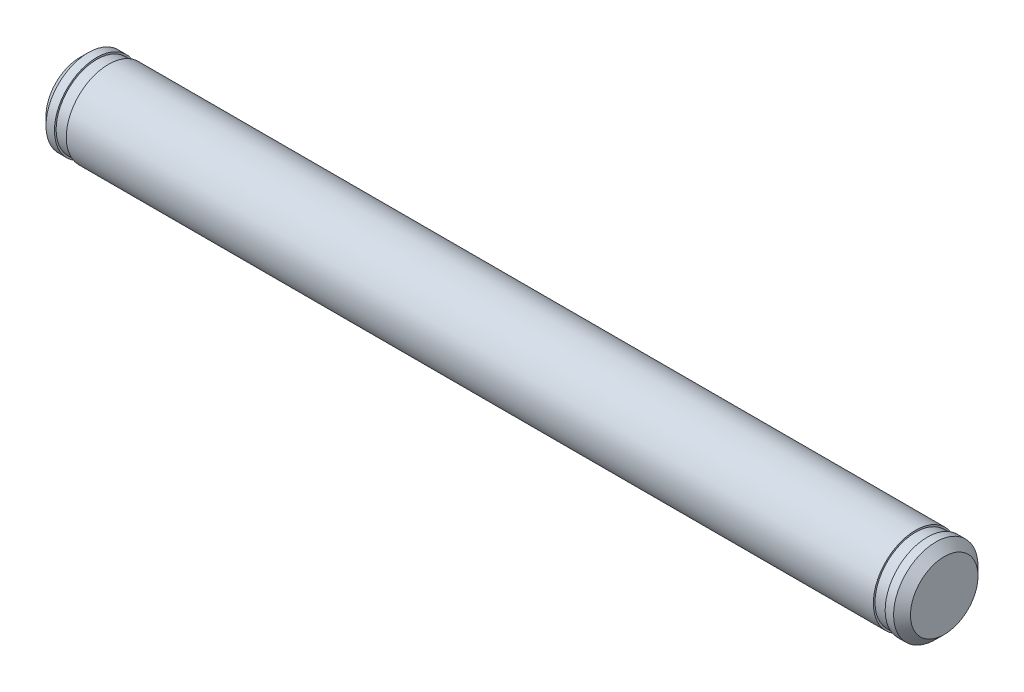
ISO-10303-21;
HEADER;
FILE_DESCRIPTION(('STEP AP214'),'2;1');
FILE_NAME('part.step','',(''),(''),'','','');
FILE_SCHEMA(('AUTOMOTIVE_DESIGN { 1 0 10303 214 1 1 1 1 }'));
ENDSEC;
DATA;
#1=APPLICATION_CONTEXT('core data for automotive mechanical design processes');
#2=APPLICATION_PROTOCOL_DEFINITION('international standard','automotive_design',2000,#1);
#3=PRODUCT_CONTEXT('',#1,'mechanical');
#4=PRODUCT('Part','Part','',(#3));
#5=PRODUCT_RELATED_PRODUCT_CATEGORY('part','',(#4));
#6=PRODUCT_DEFINITION_FORMATION('','',#4);
#7=PRODUCT_DEFINITION_CONTEXT('part definition',#1,'design');
#8=PRODUCT_DEFINITION('design','',#6,#7);
#9=PRODUCT_DEFINITION_SHAPE('','',#8);
#10=(LENGTH_UNIT() NAMED_UNIT(*) SI_UNIT(.MILLI.,.METRE.));
#11=(NAMED_UNIT(*) PLANE_ANGLE_UNIT() SI_UNIT($,.RADIAN.));
#12=(NAMED_UNIT(*) SI_UNIT($,.STERADIAN.) SOLID_ANGLE_UNIT());
#13=UNCERTAINTY_MEASURE_WITH_UNIT(LENGTH_MEASURE(1.E-05),#10,'distance_accuracy_value','');
#14=(GEOMETRIC_REPRESENTATION_CONTEXT(3) GLOBAL_UNCERTAINTY_ASSIGNED_CONTEXT((#13)) GLOBAL_UNIT_ASSIGNED_CONTEXT((#10,
#11,#12)) REPRESENTATION_CONTEXT('',''));
#15=CARTESIAN_POINT('',(0.,0.,0.));
#16=DIRECTION('',(0.,0.,1.));
#17=DIRECTION('',(1.,0.,0.));
#18=AXIS2_PLACEMENT_3D('',#15,#16,#17);
#19=CARTESIAN_POINT('',(-25.6,0.,0.));
#20=DIRECTION('',(-1.,0.,0.));
#21=DIRECTION('',(0.,-1.,0.));
#22=AXIS2_PLACEMENT_3D('',#19,#20,#21);
#23=PLANE('',#22);
#24=CARTESIAN_POINT('',(-25.6,0.,0.));
#25=DIRECTION('',(-1.,0.,0.));
#26=DIRECTION('',(0.,-1.,0.));
#27=AXIS2_PLACEMENT_3D('',#24,#25,#26);
#28=CIRCLE('',#27,2.);
#29=CARTESIAN_POINT('',(-25.6,-2.,0.));
#30=VERTEX_POINT('',#29);
#31=EDGE_CURVE('E10',#30,#30,#28,.T.);
#32=ORIENTED_EDGE('',*,*,#31,.T.);
#33=EDGE_LOOP('',(#32));
#34=FACE_BOUND('',#33,.T.);
#35=ADVANCED_FACE('F34',(#34),#23,.T.);
#36=CARTESIAN_POINT('',(25.6,0.,0.));
#37=DIRECTION('',(1.,0.,0.));
#38=DIRECTION('',(0.,1.,0.));
#39=AXIS2_PLACEMENT_3D('',#36,#37,#38);
#40=CYLINDRICAL_SURFACE('',#39,2.5);
#41=CARTESIAN_POINT('',(-25.1,0.,0.));
#42=DIRECTION('',(-1.,0.,0.));
#43=DIRECTION('',(0.,-1.,0.));
#44=AXIS2_PLACEMENT_3D('',#41,#42,#43);
#45=CIRCLE('',#44,2.5);
#46=CARTESIAN_POINT('',(-25.1,-2.5,0.));
#47=VERTEX_POINT('',#46);
#48=EDGE_CURVE('E42',#47,#47,#45,.F.);
#49=ORIENTED_EDGE('',*,*,#48,.T.);
#50=EDGE_LOOP('',(#49));
#51=FACE_BOUND('',#50,.T.);
#52=CARTESIAN_POINT('',(-24.6,0.,0.));
#53=DIRECTION('',(1.,0.,0.));
#54=DIRECTION('',(0.,1.,0.));
#55=AXIS2_PLACEMENT_3D('',#52,#53,#54);
#56=CIRCLE('',#55,2.5);
#57=CARTESIAN_POINT('',(-24.6,2.49999999999999,0.));
#58=VERTEX_POINT('',#57);
#59=EDGE_CURVE('E55',#58,#58,#56,.T.);
#60=ORIENTED_EDGE('',*,*,#59,.F.);
#61=EDGE_LOOP('',(#60));
#62=FACE_BOUND('',#61,.T.);
#63=ADVANCED_FACE('F98',(#51,#62),#40,.T.);
#64=CARTESIAN_POINT('',(-24.6,2.49999999999999,0.));
#65=DIRECTION('',(1.,0.,0.));
#66=DIRECTION('',(0.,1.,0.));
#67=AXIS2_PLACEMENT_3D('',#64,#65,#66);
#68=PLANE('',#67);
#69=ORIENTED_EDGE('',*,*,#59,.T.);
#70=EDGE_LOOP('',(#69));
#71=FACE_BOUND('',#70,.T.);
#72=CARTESIAN_POINT('',(-24.6,0.,0.));
#73=DIRECTION('',(1.,0.,0.));
#74=DIRECTION('',(0.,1.,0.));
#75=AXIS2_PLACEMENT_3D('',#72,#73,#74);
#76=CIRCLE('',#75,2.4);
#77=CARTESIAN_POINT('',(-24.6,2.39999999999999,0.));
#78=VERTEX_POINT('',#77);
#79=EDGE_CURVE('E58',#78,#78,#76,.T.);
#80=ORIENTED_EDGE('',*,*,#79,.F.);
#81=EDGE_LOOP('',(#80));
#82=FACE_BOUND('',#81,.T.);
#83=ADVANCED_FACE('F103',(#71,#82),#68,.T.);
#84=CARTESIAN_POINT('',(25.6,0.,0.));
#85=DIRECTION('',(1.,0.,0.));
#86=DIRECTION('',(0.,1.,0.));
#87=AXIS2_PLACEMENT_3D('',#84,#85,#86);
#88=CYLINDRICAL_SURFACE('',#87,2.4);
#89=ORIENTED_EDGE('',*,*,#79,.T.);
#90=EDGE_LOOP('',(#89));
#91=FACE_BOUND('',#90,.T.);
#92=CARTESIAN_POINT('',(-23.9,0.,0.));
#93=DIRECTION('',(1.,0.,0.));
#94=DIRECTION('',(0.,1.,0.));
#95=AXIS2_PLACEMENT_3D('',#92,#93,#94);
#96=CIRCLE('',#95,2.4);
#97=CARTESIAN_POINT('',(-23.9,2.39999999999999,0.));
#98=VERTEX_POINT('',#97);
#99=EDGE_CURVE('E61',#98,#98,#96,.T.);
#100=ORIENTED_EDGE('',*,*,#99,.F.);
#101=EDGE_LOOP('',(#100));
#102=FACE_BOUND('',#101,.T.);
#103=ADVANCED_FACE('F179',(#91,#102),#88,.T.);
#104=CARTESIAN_POINT('',(-23.9,2.39999999999999,0.));
#105=DIRECTION('',(-1.,0.,0.));
#106=DIRECTION('',(0.,-1.,0.));
#107=AXIS2_PLACEMENT_3D('',#104,#105,#106);
#108=PLANE('',#107);
#109=ORIENTED_EDGE('',*,*,#99,.T.);
#110=EDGE_LOOP('',(#109));
#111=FACE_BOUND('',#110,.T.);
#112=CARTESIAN_POINT('',(-23.9,0.,0.));
#113=DIRECTION('',(1.,0.,0.));
#114=DIRECTION('',(0.,1.,0.));
#115=AXIS2_PLACEMENT_3D('',#112,#113,#114);
#116=CIRCLE('',#115,2.5);
#117=CARTESIAN_POINT('',(-23.9,2.49999999999999,0.));
#118=VERTEX_POINT('',#117);
#119=EDGE_CURVE('E64',#118,#118,#116,.T.);
#120=ORIENTED_EDGE('',*,*,#119,.F.);
#121=EDGE_LOOP('',(#120));
#122=FACE_BOUND('',#121,.T.);
#123=ADVANCED_FACE('F169',(#111,#122),#108,.T.);
#124=CARTESIAN_POINT('',(25.6,0.,0.));
#125=DIRECTION('',(1.,0.,0.));
#126=DIRECTION('',(0.,1.,0.));
#127=AXIS2_PLACEMENT_3D('',#124,#125,#126);
#128=CYLINDRICAL_SURFACE('',#127,2.5);
#129=ORIENTED_EDGE('',*,*,#119,.T.);
#130=EDGE_LOOP('',(#129));
#131=FACE_BOUND('',#130,.T.);
#132=CARTESIAN_POINT('',(23.9,0.,0.));
#133=DIRECTION('',(1.,0.,0.));
#134=DIRECTION('',(0.,1.,0.));
#135=AXIS2_PLACEMENT_3D('',#132,#133,#134);
#136=CIRCLE('',#135,2.5);
#137=CARTESIAN_POINT('',(23.9,2.5,0.));
#138=VERTEX_POINT('',#137);
#139=EDGE_CURVE('E67',#138,#138,#136,.T.);
#140=ORIENTED_EDGE('',*,*,#139,.F.);
#141=EDGE_LOOP('',(#140));
#142=FACE_BOUND('',#141,.T.);
#143=ADVANCED_FACE('F159',(#131,#142),#128,.T.);
#144=CARTESIAN_POINT('',(23.9,2.4,0.));
#145=DIRECTION('',(1.,0.,0.));
#146=DIRECTION('',(0.,1.,0.));
#147=AXIS2_PLACEMENT_3D('',#144,#145,#146);
#148=PLANE('',#147);
#149=ORIENTED_EDGE('',*,*,#139,.T.);
#150=EDGE_LOOP('',(#149));
#151=FACE_BOUND('',#150,.T.);
#152=CARTESIAN_POINT('',(23.9,0.,0.));
#153=DIRECTION('',(1.,0.,0.));
#154=DIRECTION('',(0.,1.,0.));
#155=AXIS2_PLACEMENT_3D('',#152,#153,#154);
#156=CIRCLE('',#155,2.4);
#157=CARTESIAN_POINT('',(23.9,2.4,0.));
#158=VERTEX_POINT('',#157);
#159=EDGE_CURVE('E70',#158,#158,#156,.T.);
#160=ORIENTED_EDGE('',*,*,#159,.F.);
#161=EDGE_LOOP('',(#160));
#162=FACE_BOUND('',#161,.T.);
#163=ADVANCED_FACE('F94',(#151,#162),#148,.T.);
#164=CARTESIAN_POINT('',(25.6,0.,0.));
#165=DIRECTION('',(1.,0.,0.));
#166=DIRECTION('',(0.,1.,0.));
#167=AXIS2_PLACEMENT_3D('',#164,#165,#166);
#168=CYLINDRICAL_SURFACE('',#167,2.4);
#169=ORIENTED_EDGE('',*,*,#159,.T.);
#170=EDGE_LOOP('',(#169));
#171=FACE_BOUND('',#170,.T.);
#172=CARTESIAN_POINT('',(24.6,0.,0.));
#173=DIRECTION('',(1.,0.,0.));
#174=DIRECTION('',(0.,1.,0.));
#175=AXIS2_PLACEMENT_3D('',#172,#173,#174);
#176=CIRCLE('',#175,2.4);
#177=CARTESIAN_POINT('',(24.6,2.4,0.));
#178=VERTEX_POINT('',#177);
#179=EDGE_CURVE('E73',#178,#178,#176,.T.);
#180=ORIENTED_EDGE('',*,*,#179,.F.);
#181=EDGE_LOOP('',(#180));
#182=FACE_BOUND('',#181,.T.);
#183=ADVANCED_FACE('F84',(#171,#182),#168,.T.);
#184=CARTESIAN_POINT('',(24.6,2.5,0.));
#185=DIRECTION('',(-1.,0.,0.));
#186=DIRECTION('',(0.,-1.,0.));
#187=AXIS2_PLACEMENT_3D('',#184,#185,#186);
#188=PLANE('',#187);
#189=ORIENTED_EDGE('',*,*,#179,.T.);
#190=EDGE_LOOP('',(#189));
#191=FACE_BOUND('',#190,.T.);
#192=CARTESIAN_POINT('',(24.6,0.,0.));
#193=DIRECTION('',(1.,0.,0.));
#194=DIRECTION('',(0.,1.,0.));
#195=AXIS2_PLACEMENT_3D('',#192,#193,#194);
#196=CIRCLE('',#195,2.5);
#197=CARTESIAN_POINT('',(24.6,2.5,0.));
#198=VERTEX_POINT('',#197);
#199=EDGE_CURVE('E76',#198,#198,#196,.T.);
#200=ORIENTED_EDGE('',*,*,#199,.F.);
#201=EDGE_LOOP('',(#200));
#202=FACE_BOUND('',#201,.T.);
#203=ADVANCED_FACE('F82',(#191,#202),#188,.T.);
#204=CARTESIAN_POINT('',(25.6,0.,0.));
#205=DIRECTION('',(1.,0.,0.));
#206=DIRECTION('',(0.,1.,0.));
#207=AXIS2_PLACEMENT_3D('',#204,#205,#206);
#208=CYLINDRICAL_SURFACE('',#207,2.5);
#209=CARTESIAN_POINT('',(25.1,0.,0.));
#210=DIRECTION('',(1.,0.,0.));
#211=DIRECTION('',(0.,1.,0.));
#212=AXIS2_PLACEMENT_3D('',#209,#210,#211);
#213=CIRCLE('',#212,2.5);
#214=CARTESIAN_POINT('',(25.1,2.5,0.));
#215=VERTEX_POINT('',#214);
#216=EDGE_CURVE('E46',#215,#215,#213,.F.);
#217=ORIENTED_EDGE('',*,*,#216,.T.);
#218=EDGE_LOOP('',(#217));
#219=FACE_BOUND('',#218,.T.);
#220=ORIENTED_EDGE('',*,*,#199,.T.);
#221=EDGE_LOOP('',(#220));
#222=FACE_BOUND('',#221,.T.);
#223=ADVANCED_FACE('F80',(#219,#222),#208,.T.);
#224=CARTESIAN_POINT('',(25.6,0.,0.));
#225=DIRECTION('',(1.,0.,0.));
#226=DIRECTION('',(0.,1.,0.));
#227=AXIS2_PLACEMENT_3D('',#224,#225,#226);
#228=PLANE('',#227);
#229=CARTESIAN_POINT('',(25.6,0.,0.));
#230=DIRECTION('',(1.,0.,0.));
#231=DIRECTION('',(0.,1.,0.));
#232=AXIS2_PLACEMENT_3D('',#229,#230,#231);
#233=CIRCLE('',#232,1.99999999999999);
#234=CARTESIAN_POINT('',(25.6,2.,0.));
#235=VERTEX_POINT('',#234);
#236=EDGE_CURVE('E50',#235,#235,#233,.T.);
#237=ORIENTED_EDGE('',*,*,#236,.T.);
#238=EDGE_LOOP('',(#237));
#239=FACE_BOUND('',#238,.T.);
#240=ADVANCED_FACE('F91',(#239),#228,.T.);
#241=CARTESIAN_POINT('',(25.6,0.,0.));
#242=DIRECTION('',(-1.,0.,0.));
#243=DIRECTION('',(0.,-1.,0.));
#244=AXIS2_PLACEMENT_3D('',#241,#242,#243);
#245=CONICAL_SURFACE('',#244,1.99999999999999,0.785398163397448);
#246=ORIENTED_EDGE('',*,*,#216,.F.);
#247=EDGE_LOOP('',(#246));
#248=FACE_BOUND('',#247,.T.);
#249=ORIENTED_EDGE('',*,*,#236,.F.);
#250=EDGE_LOOP('',(#249));
#251=FACE_BOUND('',#250,.T.);
#252=ADVANCED_FACE('F107',(#248,#251),#245,.T.);
#253=CARTESIAN_POINT('',(-25.1,0.,0.));
#254=DIRECTION('',(1.,0.,0.));
#255=DIRECTION('',(0.,1.,0.));
#256=AXIS2_PLACEMENT_3D('',#253,#254,#255);
#257=CONICAL_SURFACE('',#256,2.5,0.785398163397451);
#258=ORIENTED_EDGE('',*,*,#31,.F.);
#259=EDGE_LOOP('',(#258));
#260=FACE_BOUND('',#259,.T.);
#261=ORIENTED_EDGE('',*,*,#48,.F.);
#262=EDGE_LOOP('',(#261));
#263=FACE_BOUND('',#262,.T.);
#264=ADVANCED_FACE('F37',(#260,#263),#257,.T.);
#265=CLOSED_SHELL('',(#35,#63,#83,#103,#123,#143,#163,#183,#203,#223,#240,#252,#264));
#266=MANIFOLD_SOLID_BREP('B2',#265);
#267=ADVANCED_BREP_SHAPE_REPRESENTATION('',(#18,#266),#14);
#268=SHAPE_DEFINITION_REPRESENTATION(#9,#267);
ENDSEC;
END-ISO-10303-21;
